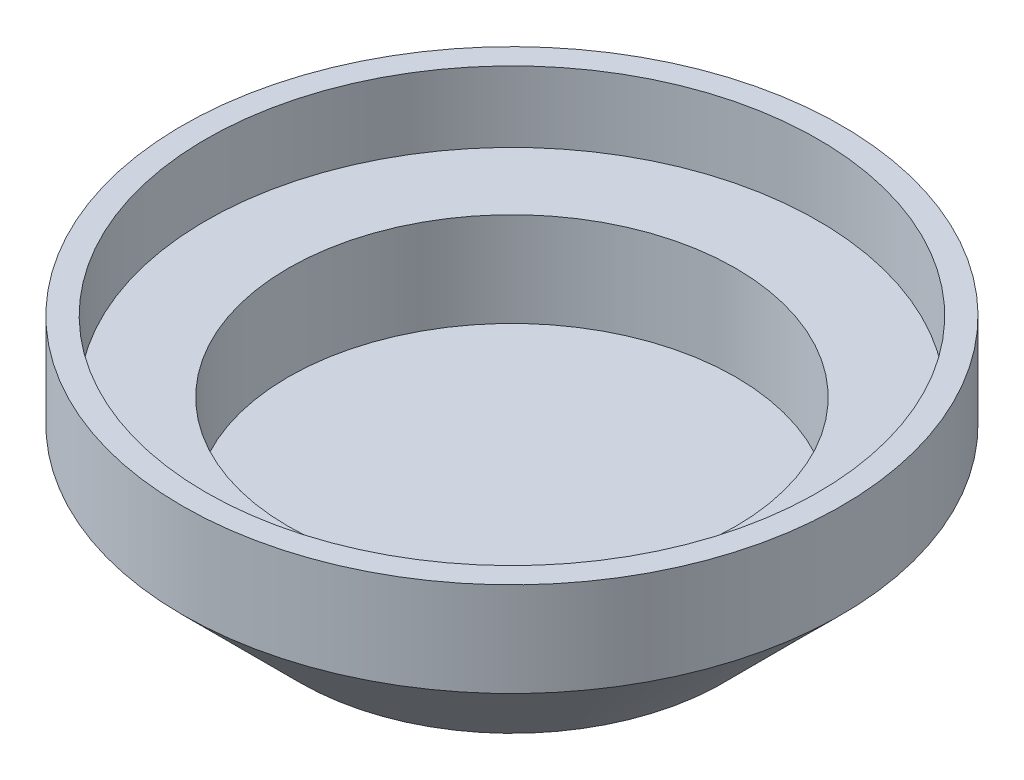
ISO-10303-21;
HEADER;
FILE_DESCRIPTION(('STEP AP214'),'2;1');
FILE_NAME('part.step','',(''),(''),'','','');
FILE_SCHEMA(('AUTOMOTIVE_DESIGN { 1 0 10303 214 1 1 1 1 }'));
ENDSEC;
DATA;
#1=APPLICATION_CONTEXT('core data for automotive mechanical design processes');
#2=APPLICATION_PROTOCOL_DEFINITION('international standard','automotive_design',2000,#1);
#3=PRODUCT_CONTEXT('',#1,'mechanical');
#4=PRODUCT('Part','Part','',(#3));
#5=PRODUCT_RELATED_PRODUCT_CATEGORY('part','',(#4));
#6=PRODUCT_DEFINITION_FORMATION('','',#4);
#7=PRODUCT_DEFINITION_CONTEXT('part definition',#1,'design');
#8=PRODUCT_DEFINITION('design','',#6,#7);
#9=PRODUCT_DEFINITION_SHAPE('','',#8);
#10=(LENGTH_UNIT() NAMED_UNIT(*) SI_UNIT(.MILLI.,.METRE.));
#11=(NAMED_UNIT(*) PLANE_ANGLE_UNIT() SI_UNIT($,.RADIAN.));
#12=(NAMED_UNIT(*) SI_UNIT($,.STERADIAN.) SOLID_ANGLE_UNIT());
#13=UNCERTAINTY_MEASURE_WITH_UNIT(LENGTH_MEASURE(1.E-05),#10,'distance_accuracy_value','');
#14=(GEOMETRIC_REPRESENTATION_CONTEXT(3) GLOBAL_UNCERTAINTY_ASSIGNED_CONTEXT((#13)) GLOBAL_UNIT_ASSIGNED_CONTEXT((#10,
#11,#12)) REPRESENTATION_CONTEXT('',''));
#15=CARTESIAN_POINT('',(0.,0.,0.));
#16=DIRECTION('',(0.,0.,1.));
#17=DIRECTION('',(1.,0.,0.));
#18=AXIS2_PLACEMENT_3D('',#15,#16,#17);
#19=CARTESIAN_POINT('',(0.,9.,0.));
#20=DIRECTION('',(0.,-1.,0.));
#21=DIRECTION('',(0.,0.,-1.));
#22=AXIS2_PLACEMENT_3D('',#19,#20,#21);
#23=CYLINDRICAL_SURFACE('',#22,14.);
#24=CARTESIAN_POINT('',(0.,5.,0.));
#25=DIRECTION('',(0.,1.,0.));
#26=DIRECTION('',(0.,0.,1.));
#27=AXIS2_PLACEMENT_3D('',#24,#25,#26);
#28=CIRCLE('',#27,14.);
#29=CARTESIAN_POINT('',(0.,5.,14.));
#30=VERTEX_POINT('',#29);
#31=EDGE_CURVE('E38',#30,#30,#28,.T.);
#32=ORIENTED_EDGE('',*,*,#31,.T.);
#33=EDGE_LOOP('',(#32));
#34=FACE_BOUND('',#33,.T.);
#35=CARTESIAN_POINT('',(0.,9.,0.));
#36=DIRECTION('',(0.,1.,0.));
#37=DIRECTION('',(0.,0.,1.));
#38=AXIS2_PLACEMENT_3D('',#35,#36,#37);
#39=CIRCLE('',#38,14.);
#40=CARTESIAN_POINT('',(0.,9.,14.));
#41=VERTEX_POINT('',#40);
#42=EDGE_CURVE('E42',#41,#41,#39,.T.);
#43=ORIENTED_EDGE('',*,*,#42,.F.);
#44=EDGE_LOOP('',(#43));
#45=FACE_BOUND('',#44,.T.);
#46=ADVANCED_FACE('F31',(#34,#45),#23,.T.);
#47=CARTESIAN_POINT('',(0.,9.,0.));
#48=DIRECTION('',(0.,1.,0.));
#49=DIRECTION('',(0.,0.,1.));
#50=AXIS2_PLACEMENT_3D('',#47,#48,#49);
#51=PLANE('',#50);
#52=CARTESIAN_POINT('',(0.,9.,0.));
#53=DIRECTION('',(0.,1.,0.));
#54=DIRECTION('',(0.,0.,1.));
#55=AXIS2_PLACEMENT_3D('',#52,#53,#54);
#56=CIRCLE('',#55,13.);
#57=CARTESIAN_POINT('',(0.,9.,13.));
#58=VERTEX_POINT('',#57);
#59=EDGE_CURVE('E49',#58,#58,#56,.T.);
#60=ORIENTED_EDGE('',*,*,#59,.F.);
#61=EDGE_LOOP('',(#60));
#62=FACE_BOUND('',#61,.T.);
#63=ORIENTED_EDGE('',*,*,#42,.T.);
#64=EDGE_LOOP('',(#63));
#65=FACE_BOUND('',#64,.T.);
#66=ADVANCED_FACE('F82',(#62,#65),#51,.T.);
#67=CARTESIAN_POINT('',(0.,0.,0.));
#68=DIRECTION('',(0.,1.,0.));
#69=DIRECTION('',(0.,0.,1.));
#70=AXIS2_PLACEMENT_3D('',#67,#68,#69);
#71=PLANE('',#70);
#72=CARTESIAN_POINT('',(0.,0.,0.));
#73=DIRECTION('',(0.,1.,0.));
#74=DIRECTION('',(0.,0.,1.));
#75=AXIS2_PLACEMENT_3D('',#72,#73,#74);
#76=CIRCLE('',#75,8.99999999999999);
#77=CARTESIAN_POINT('',(0.,0.,8.99999999999999));
#78=VERTEX_POINT('',#77);
#79=EDGE_CURVE('E10',#78,#78,#76,.F.);
#80=ORIENTED_EDGE('',*,*,#79,.T.);
#81=EDGE_LOOP('',(#80));
#82=FACE_BOUND('',#81,.T.);
#83=ADVANCED_FACE('F78',(#82),#71,.F.);
#84=CARTESIAN_POINT('',(0.,6.,0.));
#85=DIRECTION('',(0.,1.,0.));
#86=DIRECTION('',(0.,0.,1.));
#87=AXIS2_PLACEMENT_3D('',#84,#85,#86);
#88=CYLINDRICAL_SURFACE('',#87,13.);
#89=CARTESIAN_POINT('',(0.,6.,0.));
#90=DIRECTION('',(0.,1.,0.));
#91=DIRECTION('',(0.,0.,1.));
#92=AXIS2_PLACEMENT_3D('',#89,#90,#91);
#93=CIRCLE('',#92,13.);
#94=CARTESIAN_POINT('',(0.,6.,13.));
#95=VERTEX_POINT('',#94);
#96=EDGE_CURVE('E46',#95,#95,#93,.T.);
#97=ORIENTED_EDGE('',*,*,#96,.F.);
#98=EDGE_LOOP('',(#97));
#99=FACE_BOUND('',#98,.T.);
#100=ORIENTED_EDGE('',*,*,#59,.T.);
#101=EDGE_LOOP('',(#100));
#102=FACE_BOUND('',#101,.T.);
#103=ADVANCED_FACE('F72',(#99,#102),#88,.F.);
#104=CARTESIAN_POINT('',(0.,6.,0.));
#105=DIRECTION('',(0.,1.,0.));
#106=DIRECTION('',(0.,0.,1.));
#107=AXIS2_PLACEMENT_3D('',#104,#105,#106);
#108=PLANE('',#107);
#109=CARTESIAN_POINT('',(0.,6.,0.));
#110=DIRECTION('',(0.,1.,0.));
#111=DIRECTION('',(0.,0.,1.));
#112=AXIS2_PLACEMENT_3D('',#109,#110,#111);
#113=CIRCLE('',#112,9.5);
#114=CARTESIAN_POINT('',(0.,6.,9.5));
#115=VERTEX_POINT('',#114);
#116=EDGE_CURVE('E55',#115,#115,#113,.T.);
#117=ORIENTED_EDGE('',*,*,#116,.F.);
#118=EDGE_LOOP('',(#117));
#119=FACE_BOUND('',#118,.T.);
#120=ORIENTED_EDGE('',*,*,#96,.T.);
#121=EDGE_LOOP('',(#120));
#122=FACE_BOUND('',#121,.T.);
#123=ADVANCED_FACE('F66',(#119,#122),#108,.T.);
#124=CARTESIAN_POINT('',(0.,2.,0.));
#125=DIRECTION('',(0.,1.,0.));
#126=DIRECTION('',(0.,0.,1.));
#127=AXIS2_PLACEMENT_3D('',#124,#125,#126);
#128=CYLINDRICAL_SURFACE('',#127,9.5);
#129=CARTESIAN_POINT('',(0.,2.,0.));
#130=DIRECTION('',(0.,1.,0.));
#131=DIRECTION('',(0.,0.,1.));
#132=AXIS2_PLACEMENT_3D('',#129,#130,#131);
#133=CIRCLE('',#132,9.5);
#134=CARTESIAN_POINT('',(0.,2.,9.5));
#135=VERTEX_POINT('',#134);
#136=EDGE_CURVE('E52',#135,#135,#133,.T.);
#137=ORIENTED_EDGE('',*,*,#136,.F.);
#138=EDGE_LOOP('',(#137));
#139=FACE_BOUND('',#138,.T.);
#140=ORIENTED_EDGE('',*,*,#116,.T.);
#141=EDGE_LOOP('',(#140));
#142=FACE_BOUND('',#141,.T.);
#143=ADVANCED_FACE('F63',(#139,#142),#128,.F.);
#144=CARTESIAN_POINT('',(0.,2.,0.));
#145=DIRECTION('',(0.,1.,0.));
#146=DIRECTION('',(0.,0.,1.));
#147=AXIS2_PLACEMENT_3D('',#144,#145,#146);
#148=PLANE('',#147);
#149=ORIENTED_EDGE('',*,*,#136,.T.);
#150=EDGE_LOOP('',(#149));
#151=FACE_BOUND('',#150,.T.);
#152=ADVANCED_FACE('F61',(#151),#148,.T.);
#153=CARTESIAN_POINT('',(0.,5.,0.));
#154=DIRECTION('',(0.,1.,0.));
#155=DIRECTION('',(0.,0.,1.));
#156=AXIS2_PLACEMENT_3D('',#153,#154,#155);
#157=CONICAL_SURFACE('',#156,14.,0.78539816339745);
#158=ORIENTED_EDGE('',*,*,#79,.F.);
#159=EDGE_LOOP('',(#158));
#160=FACE_BOUND('',#159,.T.);
#161=ORIENTED_EDGE('',*,*,#31,.F.);
#162=EDGE_LOOP('',(#161));
#163=FACE_BOUND('',#162,.T.);
#164=ADVANCED_FACE('F33',(#160,#163),#157,.T.);
#165=CLOSED_SHELL('',(#46,#66,#83,#103,#123,#143,#152,#164));
#166=MANIFOLD_SOLID_BREP('B2',#165);
#167=ADVANCED_BREP_SHAPE_REPRESENTATION('',(#18,#166),#14);
#168=SHAPE_DEFINITION_REPRESENTATION(#9,#167);
ENDSEC;
END-ISO-10303-21;
